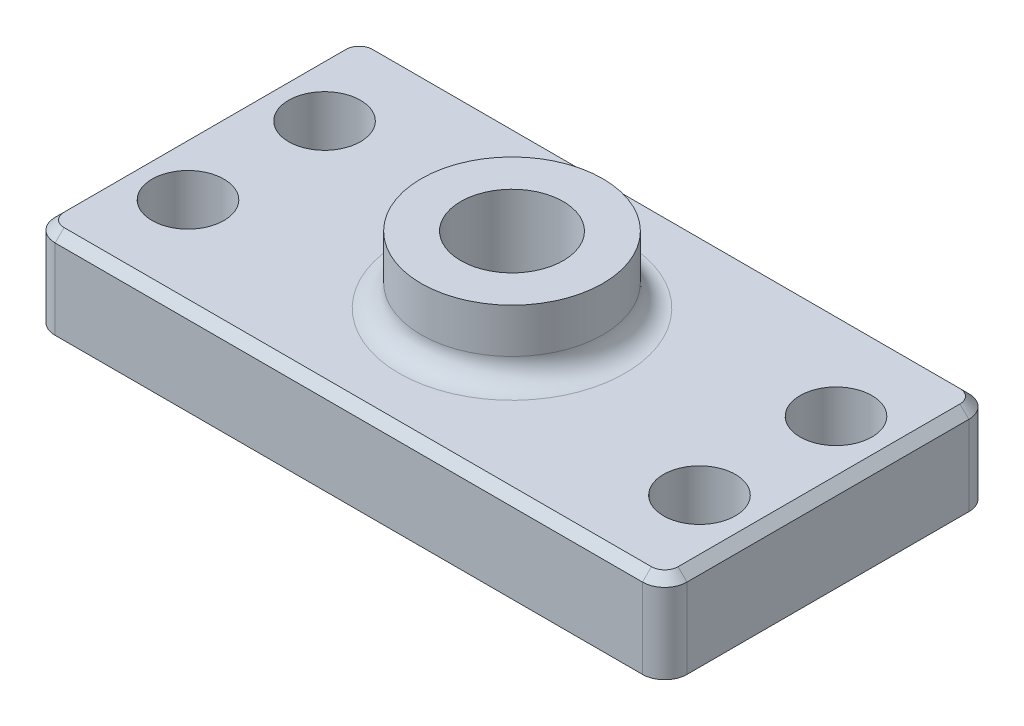
ISO-10303-21;
HEADER;
FILE_DESCRIPTION(('STEP AP214'),'2;1');
FILE_NAME('part.step','',(''),(''),'','','');
FILE_SCHEMA(('AUTOMOTIVE_DESIGN { 1 0 10303 214 1 1 1 1 }'));
ENDSEC;
DATA;
#1=APPLICATION_CONTEXT('core data for automotive mechanical design processes');
#2=APPLICATION_PROTOCOL_DEFINITION('international standard','automotive_design',2000,#1);
#3=PRODUCT_CONTEXT('',#1,'mechanical');
#4=PRODUCT('Part','Part','',(#3));
#5=PRODUCT_RELATED_PRODUCT_CATEGORY('part','',(#4));
#6=PRODUCT_DEFINITION_FORMATION('','',#4);
#7=PRODUCT_DEFINITION_CONTEXT('part definition',#1,'design');
#8=PRODUCT_DEFINITION('design','',#6,#7);
#9=PRODUCT_DEFINITION_SHAPE('','',#8);
#10=(LENGTH_UNIT() NAMED_UNIT(*) SI_UNIT(.MILLI.,.METRE.));
#11=(NAMED_UNIT(*) PLANE_ANGLE_UNIT() SI_UNIT($,.RADIAN.));
#12=(NAMED_UNIT(*) SI_UNIT($,.STERADIAN.) SOLID_ANGLE_UNIT());
#13=UNCERTAINTY_MEASURE_WITH_UNIT(LENGTH_MEASURE(1.E-05),#10,'distance_accuracy_value','');
#14=(GEOMETRIC_REPRESENTATION_CONTEXT(3) GLOBAL_UNCERTAINTY_ASSIGNED_CONTEXT((#13)) GLOBAL_UNIT_ASSIGNED_CONTEXT((#10,
#11,#12)) REPRESENTATION_CONTEXT('',''));
#15=CARTESIAN_POINT('',(0.,0.,0.));
#16=DIRECTION('',(0.,0.,1.));
#17=DIRECTION('',(1.,0.,0.));
#18=AXIS2_PLACEMENT_3D('',#15,#16,#17);
#19=CARTESIAN_POINT('',(0.,25.4,46.621775147929));
#20=DIRECTION('',(0.,0.,-1.));
#21=DIRECTION('',(-1.,0.,0.));
#22=AXIS2_PLACEMENT_3D('',#19,#20,#21);
#23=PLANE('',#22);
#24=DIRECTION('',(0.,-1.,0.));
#25=VECTOR('',#24,1.);
#26=CARTESIAN_POINT('',(83.9176923076923,25.4,46.621775147929));
#27=LINE('',#26,#25);
#28=CARTESIAN_POINT('',(83.9176923076923,0.,46.621775147929));
#29=VERTEX_POINT('',#28);
#30=CARTESIAN_POINT('',(83.9176923076923,22.86,46.621775147929));
#31=VERTEX_POINT('',#30);
#32=EDGE_CURVE('E181',#29,#31,#27,.F.);
#33=ORIENTED_EDGE('',*,*,#32,.T.);
#34=DIRECTION('',(-1.,0.,0.));
#35=VECTOR('',#34,1.);
#36=CARTESIAN_POINT('',(-83.9176923076923,22.86,46.621775147929));
#37=LINE('',#36,#35);
#38=CARTESIAN_POINT('',(-83.9176923076923,22.86,46.621775147929));
#39=VERTEX_POINT('',#38);
#40=EDGE_CURVE('E11',#31,#39,#37,.T.);
#41=ORIENTED_EDGE('',*,*,#40,.T.);
#42=DIRECTION('',(0.,-1.,0.));
#43=VECTOR('',#42,1.);
#44=CARTESIAN_POINT('',(-83.9176923076923,0.,46.621775147929));
#45=LINE('',#44,#43);
#46=CARTESIAN_POINT('',(-83.9176923076923,0.,46.621775147929));
#47=VERTEX_POINT('',#46);
#48=EDGE_CURVE('E179',#39,#47,#45,.T.);
#49=ORIENTED_EDGE('',*,*,#48,.T.);
#50=DIRECTION('',(1.,0.,0.));
#51=VECTOR('',#50,1.);
#52=CARTESIAN_POINT('',(0.,0.,46.621775147929));
#53=LINE('',#52,#51);
#54=EDGE_CURVE('E132',#47,#29,#53,.T.);
#55=ORIENTED_EDGE('',*,*,#54,.T.);
#56=EDGE_LOOP('',(#33,#41,#49,#55));
#57=FACE_BOUND('',#56,.T.);
#58=ADVANCED_FACE('F35',(#57),#23,.F.);
#59=CARTESIAN_POINT('',(90.2676923076923,25.4,0.));
#60=DIRECTION('',(-1.,0.,0.));
#61=DIRECTION('',(0.,0.,1.));
#62=AXIS2_PLACEMENT_3D('',#59,#60,#61);
#63=PLANE('',#62);
#64=DIRECTION('',(0.,-1.,0.));
#65=VECTOR('',#64,1.);
#66=CARTESIAN_POINT('',(90.2676923076923,25.4,-40.271775147929));
#67=LINE('',#66,#65);
#68=CARTESIAN_POINT('',(90.2676923076923,0.,-40.271775147929));
#69=VERTEX_POINT('',#68);
#70=CARTESIAN_POINT('',(90.2676923076923,22.86,-40.271775147929));
#71=VERTEX_POINT('',#70);
#72=EDGE_CURVE('E176',#69,#71,#67,.F.);
#73=ORIENTED_EDGE('',*,*,#72,.T.);
#74=DIRECTION('',(0.,0.,1.));
#75=VECTOR('',#74,1.);
#76=CARTESIAN_POINT('',(90.2676923076923,22.86,40.271775147929));
#77=LINE('',#76,#75);
#78=CARTESIAN_POINT('',(90.2676923076923,22.86,40.271775147929));
#79=VERTEX_POINT('',#78);
#80=EDGE_CURVE('E212',#71,#79,#77,.T.);
#81=ORIENTED_EDGE('',*,*,#80,.T.);
#82=DIRECTION('',(0.,-1.,0.));
#83=VECTOR('',#82,1.);
#84=CARTESIAN_POINT('',(90.2676923076923,25.4,40.271775147929));
#85=LINE('',#84,#83);
#86=CARTESIAN_POINT('',(90.2676923076923,0.,40.271775147929));
#87=VERTEX_POINT('',#86);
#88=EDGE_CURVE('E174',#79,#87,#85,.T.);
#89=ORIENTED_EDGE('',*,*,#88,.T.);
#90=DIRECTION('',(0.,0.,-1.));
#91=VECTOR('',#90,1.);
#92=CARTESIAN_POINT('',(90.2676923076923,0.,0.));
#93=LINE('',#92,#91);
#94=EDGE_CURVE('E267',#87,#69,#93,.T.);
#95=ORIENTED_EDGE('',*,*,#94,.T.);
#96=EDGE_LOOP('',(#73,#81,#89,#95));
#97=FACE_BOUND('',#96,.T.);
#98=ADVANCED_FACE('F295',(#97),#63,.F.);
#99=CARTESIAN_POINT('',(0.,25.4,-46.621775147929));
#100=DIRECTION('',(0.,0.,-1.));
#101=DIRECTION('',(-1.,0.,0.));
#102=AXIS2_PLACEMENT_3D('',#99,#100,#101);
#103=PLANE('',#102);
#104=DIRECTION('',(0.,-1.,0.));
#105=VECTOR('',#104,1.);
#106=CARTESIAN_POINT('',(-83.9176923076923,25.4,-46.621775147929));
#107=LINE('',#106,#105);
#108=CARTESIAN_POINT('',(-83.9176923076923,0.,-46.621775147929));
#109=VERTEX_POINT('',#108);
#110=CARTESIAN_POINT('',(-83.9176923076923,22.86,-46.621775147929));
#111=VERTEX_POINT('',#110);
#112=EDGE_CURVE('E168',#109,#111,#107,.F.);
#113=ORIENTED_EDGE('',*,*,#112,.T.);
#114=DIRECTION('',(1.,0.,0.));
#115=VECTOR('',#114,1.);
#116=CARTESIAN_POINT('',(0.,22.86,-46.621775147929));
#117=LINE('',#116,#115);
#118=CARTESIAN_POINT('',(83.9176923076923,22.86,-46.621775147929));
#119=VERTEX_POINT('',#118);
#120=EDGE_CURVE('E186',#111,#119,#117,.T.);
#121=ORIENTED_EDGE('',*,*,#120,.T.);
#122=DIRECTION('',(0.,-1.,0.));
#123=VECTOR('',#122,1.);
#124=CARTESIAN_POINT('',(83.9176923076923,0.,-46.621775147929));
#125=LINE('',#124,#123);
#126=CARTESIAN_POINT('',(83.9176923076923,0.,-46.621775147929));
#127=VERTEX_POINT('',#126);
#128=EDGE_CURVE('E166',#119,#127,#125,.T.);
#129=ORIENTED_EDGE('',*,*,#128,.T.);
#130=DIRECTION('',(1.,0.,0.));
#131=VECTOR('',#130,1.);
#132=CARTESIAN_POINT('',(0.,0.,-46.621775147929));
#133=LINE('',#132,#131);
#134=EDGE_CURVE('E146',#109,#127,#133,.T.);
#135=ORIENTED_EDGE('',*,*,#134,.F.);
#136=EDGE_LOOP('',(#113,#121,#129,#135));
#137=FACE_BOUND('',#136,.T.);
#138=ADVANCED_FACE('F300',(#137),#103,.T.);
#139=CARTESIAN_POINT('',(73.0738461538461,25.4,19.5084023668639));
#140=DIRECTION('',(0.,-1.,0.));
#141=DIRECTION('',(0.,0.,-1.));
#142=AXIS2_PLACEMENT_3D('',#139,#140,#141);
#143=CYLINDRICAL_SURFACE('',#142,10.2714876781594);
#144=CARTESIAN_POINT('',(73.0738461538461,25.4,19.5084023668639));
#145=DIRECTION('',(0.,1.,0.));
#146=DIRECTION('',(0.,0.,1.));
#147=AXIS2_PLACEMENT_3D('',#144,#145,#146);
#148=CIRCLE('',#147,10.2714876781594);
#149=CARTESIAN_POINT('',(73.0738461538461,25.4,29.7798900450233));
#150=VERTEX_POINT('',#149);
#151=EDGE_CURVE('E155',#150,#150,#148,.T.);
#152=ORIENTED_EDGE('',*,*,#151,.T.);
#153=EDGE_LOOP('',(#152));
#154=FACE_BOUND('',#153,.T.);
#155=CARTESIAN_POINT('',(73.0738461538461,0.,19.5084023668639));
#156=DIRECTION('',(0.,1.,0.));
#157=DIRECTION('',(0.,0.,1.));
#158=AXIS2_PLACEMENT_3D('',#155,#156,#157);
#159=CIRCLE('',#158,10.2714876781594);
#160=CARTESIAN_POINT('',(73.0738461538461,0.,29.7798900450233));
#161=VERTEX_POINT('',#160);
#162=EDGE_CURVE('E145',#161,#161,#159,.T.);
#163=ORIENTED_EDGE('',*,*,#162,.F.);
#164=EDGE_LOOP('',(#163));
#165=FACE_BOUND('',#164,.T.);
#166=ADVANCED_FACE('F387',(#154,#165),#143,.F.);
#167=CARTESIAN_POINT('',(-90.2676923076923,25.4,0.));
#168=DIRECTION('',(-1.,0.,0.));
#169=DIRECTION('',(0.,0.,1.));
#170=AXIS2_PLACEMENT_3D('',#167,#168,#169);
#171=PLANE('',#170);
#172=DIRECTION('',(0.,-1.,0.));
#173=VECTOR('',#172,1.);
#174=CARTESIAN_POINT('',(-90.2676923076923,25.4,40.271775147929));
#175=LINE('',#174,#173);
#176=CARTESIAN_POINT('',(-90.2676923076923,0.,40.271775147929));
#177=VERTEX_POINT('',#176);
#178=CARTESIAN_POINT('',(-90.2676923076923,22.86,40.271775147929));
#179=VERTEX_POINT('',#178);
#180=EDGE_CURVE('E141',#177,#179,#175,.F.);
#181=ORIENTED_EDGE('',*,*,#180,.T.);
#182=DIRECTION('',(0.,0.,-1.));
#183=VECTOR('',#182,1.);
#184=CARTESIAN_POINT('',(-90.2676923076923,22.86,0.));
#185=LINE('',#184,#183);
#186=CARTESIAN_POINT('',(-90.2676923076923,22.86,-40.271775147929));
#187=VERTEX_POINT('',#186);
#188=EDGE_CURVE('E210',#179,#187,#185,.T.);
#189=ORIENTED_EDGE('',*,*,#188,.T.);
#190=DIRECTION('',(0.,-1.,0.));
#191=VECTOR('',#190,1.);
#192=CARTESIAN_POINT('',(-90.2676923076923,25.4,-40.271775147929));
#193=LINE('',#192,#191);
#194=CARTESIAN_POINT('',(-90.2676923076923,0.,-40.271775147929));
#195=VERTEX_POINT('',#194);
#196=EDGE_CURVE('E136',#187,#195,#193,.T.);
#197=ORIENTED_EDGE('',*,*,#196,.T.);
#198=DIRECTION('',(0.,0.,-1.));
#199=VECTOR('',#198,1.);
#200=CARTESIAN_POINT('',(-90.2676923076923,0.,0.));
#201=LINE('',#200,#199);
#202=EDGE_CURVE('E130',#177,#195,#201,.T.);
#203=ORIENTED_EDGE('',*,*,#202,.F.);
#204=EDGE_LOOP('',(#181,#189,#197,#203));
#205=FACE_BOUND('',#204,.T.);
#206=ADVANCED_FACE('F140',(#205),#171,.T.);
#207=CARTESIAN_POINT('',(-73.0738461538461,25.4,-19.5084023668639));
#208=DIRECTION('',(0.,-1.,0.));
#209=DIRECTION('',(0.,0.,-1.));
#210=AXIS2_PLACEMENT_3D('',#207,#208,#209);
#211=CYLINDRICAL_SURFACE('',#210,10.2714876781594);
#212=CARTESIAN_POINT('',(-73.0738461538461,25.4,-19.5084023668639));
#213=DIRECTION('',(0.,1.,0.));
#214=DIRECTION('',(0.,0.,1.));
#215=AXIS2_PLACEMENT_3D('',#212,#213,#214);
#216=CIRCLE('',#215,10.2714876781594);
#217=CARTESIAN_POINT('',(-73.0738461538461,25.4,-9.23691468870453));
#218=VERTEX_POINT('',#217);
#219=EDGE_CURVE('E256',#218,#218,#216,.T.);
#220=ORIENTED_EDGE('',*,*,#219,.T.);
#221=EDGE_LOOP('',(#220));
#222=FACE_BOUND('',#221,.T.);
#223=CARTESIAN_POINT('',(-73.0738461538461,0.,-19.5084023668639));
#224=DIRECTION('',(0.,1.,0.));
#225=DIRECTION('',(0.,0.,1.));
#226=AXIS2_PLACEMENT_3D('',#223,#224,#225);
#227=CIRCLE('',#226,10.2714876781594);
#228=CARTESIAN_POINT('',(-73.0738461538461,0.,-9.23691468870453));
#229=VERTEX_POINT('',#228);
#230=EDGE_CURVE('E263',#229,#229,#227,.T.);
#231=ORIENTED_EDGE('',*,*,#230,.F.);
#232=EDGE_LOOP('',(#231));
#233=FACE_BOUND('',#232,.T.);
#234=ADVANCED_FACE('F305',(#222,#233),#211,.F.);
#235=CARTESIAN_POINT('',(73.0738461538461,25.4,-19.5084023668639));
#236=DIRECTION('',(0.,-1.,0.));
#237=DIRECTION('',(0.,0.,-1.));
#238=AXIS2_PLACEMENT_3D('',#235,#236,#237);
#239=CYLINDRICAL_SURFACE('',#238,10.2714876781594);
#240=CARTESIAN_POINT('',(73.0738461538461,25.4,-19.5084023668639));
#241=DIRECTION('',(0.,1.,0.));
#242=DIRECTION('',(0.,0.,1.));
#243=AXIS2_PLACEMENT_3D('',#240,#241,#242);
#244=CIRCLE('',#243,10.2714876781594);
#245=CARTESIAN_POINT('',(73.0738461538461,25.4,-9.23691468870453));
#246=VERTEX_POINT('',#245);
#247=EDGE_CURVE('E253',#246,#246,#244,.F.);
#248=ORIENTED_EDGE('',*,*,#247,.F.);
#249=EDGE_LOOP('',(#248));
#250=FACE_BOUND('',#249,.T.);
#251=CARTESIAN_POINT('',(73.0738461538461,0.,-19.5084023668639));
#252=DIRECTION('',(0.,1.,0.));
#253=DIRECTION('',(0.,0.,1.));
#254=AXIS2_PLACEMENT_3D('',#251,#252,#253);
#255=CIRCLE('',#254,10.2714876781594);
#256=CARTESIAN_POINT('',(73.0738461538461,0.,-9.23691468870453));
#257=VERTEX_POINT('',#256);
#258=EDGE_CURVE('E252',#257,#257,#255,.F.);
#259=ORIENTED_EDGE('',*,*,#258,.T.);
#260=EDGE_LOOP('',(#259));
#261=FACE_BOUND('',#260,.T.);
#262=ADVANCED_FACE('F308',(#250,#261),#239,.F.);
#263=CARTESIAN_POINT('',(-73.0738461538461,25.4,19.5084023668639));
#264=DIRECTION('',(0.,-1.,0.));
#265=DIRECTION('',(0.,0.,-1.));
#266=AXIS2_PLACEMENT_3D('',#263,#264,#265);
#267=CYLINDRICAL_SURFACE('',#266,10.2714876781594);
#268=CARTESIAN_POINT('',(-73.0738461538461,25.4,19.5084023668639));
#269=DIRECTION('',(0.,1.,0.));
#270=DIRECTION('',(0.,0.,1.));
#271=AXIS2_PLACEMENT_3D('',#268,#269,#270);
#272=CIRCLE('',#271,10.2714876781594);
#273=CARTESIAN_POINT('',(-73.0738461538461,25.4,29.7798900450233));
#274=VERTEX_POINT('',#273);
#275=EDGE_CURVE('E151',#274,#274,#272,.F.);
#276=ORIENTED_EDGE('',*,*,#275,.F.);
#277=EDGE_LOOP('',(#276));
#278=FACE_BOUND('',#277,.T.);
#279=CARTESIAN_POINT('',(-73.0738461538461,0.,19.5084023668639));
#280=DIRECTION('',(0.,1.,0.));
#281=DIRECTION('',(0.,0.,1.));
#282=AXIS2_PLACEMENT_3D('',#279,#280,#281);
#283=CIRCLE('',#282,10.2714876781594);
#284=CARTESIAN_POINT('',(-73.0738461538461,0.,29.7798900450233));
#285=VERTEX_POINT('',#284);
#286=EDGE_CURVE('E158',#285,#285,#283,.F.);
#287=ORIENTED_EDGE('',*,*,#286,.T.);
#288=EDGE_LOOP('',(#287));
#289=FACE_BOUND('',#288,.T.);
#290=ADVANCED_FACE('F276',(#278,#289),#267,.F.);
#291=CARTESIAN_POINT('',(0.,25.4,0.));
#292=DIRECTION('',(0.,1.,0.));
#293=DIRECTION('',(0.,0.,1.));
#294=AXIS2_PLACEMENT_3D('',#291,#292,#293);
#295=PLANE('',#294);
#296=CARTESIAN_POINT('',(83.9176923076923,25.4,-40.271775147929));
#297=DIRECTION('',(0.,1.,0.));
#298=DIRECTION('',(0.,0.,1.));
#299=AXIS2_PLACEMENT_3D('',#296,#297,#298);
#300=CIRCLE('',#299,3.80999999999998);
#301=CARTESIAN_POINT('',(87.7276923076923,25.4,-40.271775147929));
#302=VERTEX_POINT('',#301);
#303=CARTESIAN_POINT('',(83.9176923076923,25.4,-44.081775147929));
#304=VERTEX_POINT('',#303);
#305=EDGE_CURVE('E199',#302,#304,#300,.T.);
#306=ORIENTED_EDGE('',*,*,#305,.T.);
#307=DIRECTION('',(-1.,0.,0.));
#308=VECTOR('',#307,1.);
#309=CARTESIAN_POINT('',(0.,25.4,-44.081775147929));
#310=LINE('',#309,#308);
#311=CARTESIAN_POINT('',(-83.9176923076923,25.4,-44.081775147929));
#312=VERTEX_POINT('',#311);
#313=EDGE_CURVE('E203',#304,#312,#310,.T.);
#314=ORIENTED_EDGE('',*,*,#313,.T.);
#315=CARTESIAN_POINT('',(-83.9176923076923,25.4,-40.271775147929));
#316=DIRECTION('',(0.,1.,0.));
#317=DIRECTION('',(0.,0.,1.));
#318=AXIS2_PLACEMENT_3D('',#315,#316,#317);
#319=CIRCLE('',#318,3.80999999999998);
#320=CARTESIAN_POINT('',(-87.7276923076923,25.4,-40.271775147929));
#321=VERTEX_POINT('',#320);
#322=EDGE_CURVE('E201',#312,#321,#319,.T.);
#323=ORIENTED_EDGE('',*,*,#322,.T.);
#324=DIRECTION('',(0.,0.,1.));
#325=VECTOR('',#324,1.);
#326=CARTESIAN_POINT('',(-87.7276923076923,25.4,0.));
#327=LINE('',#326,#325);
#328=CARTESIAN_POINT('',(-87.7276923076923,25.4,40.271775147929));
#329=VERTEX_POINT('',#328);
#330=EDGE_CURVE('E197',#321,#329,#327,.T.);
#331=ORIENTED_EDGE('',*,*,#330,.T.);
#332=CARTESIAN_POINT('',(-83.9176923076923,25.4,40.271775147929));
#333=DIRECTION('',(0.,1.,0.));
#334=DIRECTION('',(0.,0.,1.));
#335=AXIS2_PLACEMENT_3D('',#332,#333,#334);
#336=CIRCLE('',#335,3.80999999999998);
#337=CARTESIAN_POINT('',(-83.9176923076923,25.4,44.081775147929));
#338=VERTEX_POINT('',#337);
#339=EDGE_CURVE('E193',#329,#338,#336,.T.);
#340=ORIENTED_EDGE('',*,*,#339,.T.);
#341=DIRECTION('',(1.,0.,0.));
#342=VECTOR('',#341,1.);
#343=CARTESIAN_POINT('',(83.9176923076923,25.4,44.081775147929));
#344=LINE('',#343,#342);
#345=CARTESIAN_POINT('',(83.9176923076923,25.4,44.081775147929));
#346=VERTEX_POINT('',#345);
#347=EDGE_CURVE('E189',#338,#346,#344,.T.);
#348=ORIENTED_EDGE('',*,*,#347,.T.);
#349=CARTESIAN_POINT('',(83.9176923076923,25.4,40.271775147929));
#350=DIRECTION('',(0.,1.,0.));
#351=DIRECTION('',(0.,0.,1.));
#352=AXIS2_PLACEMENT_3D('',#349,#350,#351);
#353=CIRCLE('',#352,3.80999999999998);
#354=CARTESIAN_POINT('',(87.7276923076923,25.4,40.271775147929));
#355=VERTEX_POINT('',#354);
#356=EDGE_CURVE('E191',#346,#355,#353,.T.);
#357=ORIENTED_EDGE('',*,*,#356,.T.);
#358=DIRECTION('',(0.,0.,-1.));
#359=VECTOR('',#358,1.);
#360=CARTESIAN_POINT('',(87.7276923076923,25.4,-40.271775147929));
#361=LINE('',#360,#359);
#362=EDGE_CURVE('E195',#355,#302,#361,.T.);
#363=ORIENTED_EDGE('',*,*,#362,.T.);
#364=EDGE_LOOP('',(#306,#314,#323,#331,#340,#348,#357,#363));
#365=FACE_BOUND('',#364,.T.);
#366=CARTESIAN_POINT('',(0.,25.4,0.));
#367=DIRECTION('',(0.,1.,0.));
#368=DIRECTION('',(0.,0.,1.));
#369=AXIS2_PLACEMENT_3D('',#366,#367,#368);
#370=CIRCLE('',#369,32.2948153627203);
#371=CARTESIAN_POINT('',(0.,25.4,32.2948153627203));
#372=VERTEX_POINT('',#371);
#373=EDGE_CURVE('E171',#372,#372,#370,.F.);
#374=ORIENTED_EDGE('',*,*,#373,.T.);
#375=EDGE_LOOP('',(#374));
#376=FACE_BOUND('',#375,.T.);
#377=ORIENTED_EDGE('',*,*,#247,.T.);
#378=EDGE_LOOP('',(#377));
#379=FACE_BOUND('',#378,.T.);
#380=ORIENTED_EDGE('',*,*,#219,.F.);
#381=EDGE_LOOP('',(#380));
#382=FACE_BOUND('',#381,.T.);
#383=ORIENTED_EDGE('',*,*,#151,.F.);
#384=EDGE_LOOP('',(#383));
#385=FACE_BOUND('',#384,.T.);
#386=ORIENTED_EDGE('',*,*,#275,.T.);
#387=EDGE_LOOP('',(#386));
#388=FACE_BOUND('',#387,.T.);
#389=ADVANCED_FACE('F280',(#365,#376,#379,#382,#385,#388),#295,.T.);
#390=CARTESIAN_POINT('',(0.,0.,0.));
#391=DIRECTION('',(0.,1.,0.));
#392=DIRECTION('',(0.,0.,1.));
#393=AXIS2_PLACEMENT_3D('',#390,#391,#392);
#394=PLANE('',#393);
#395=CARTESIAN_POINT('',(0.,0.,0.));
#396=DIRECTION('',(0.,1.,0.));
#397=DIRECTION('',(0.,0.,1.));
#398=AXIS2_PLACEMENT_3D('',#395,#396,#397);
#399=CIRCLE('',#398,14.6480029344672);
#400=CARTESIAN_POINT('',(0.,0.,14.6480029344672));
#401=VERTEX_POINT('',#400);
#402=EDGE_CURVE('E242',#401,#401,#399,.T.);
#403=ORIENTED_EDGE('',*,*,#402,.T.);
#404=EDGE_LOOP('',(#403));
#405=FACE_BOUND('',#404,.T.);
#406=ORIENTED_EDGE('',*,*,#258,.F.);
#407=EDGE_LOOP('',(#406));
#408=FACE_BOUND('',#407,.T.);
#409=ORIENTED_EDGE('',*,*,#230,.T.);
#410=EDGE_LOOP('',(#409));
#411=FACE_BOUND('',#410,.T.);
#412=ORIENTED_EDGE('',*,*,#202,.T.);
#413=CARTESIAN_POINT('',(-83.9176923076923,0.,-40.271775147929));
#414=DIRECTION('',(0.,1.,0.));
#415=DIRECTION('',(0.,0.,1.));
#416=AXIS2_PLACEMENT_3D('',#413,#414,#415);
#417=CIRCLE('',#416,6.35);
#418=EDGE_CURVE('E164',#195,#109,#417,.F.);
#419=ORIENTED_EDGE('',*,*,#418,.T.);
#420=ORIENTED_EDGE('',*,*,#134,.T.);
#421=CARTESIAN_POINT('',(83.9176923076923,0.,-40.271775147929));
#422=DIRECTION('',(0.,1.,0.));
#423=DIRECTION('',(0.,0.,1.));
#424=AXIS2_PLACEMENT_3D('',#421,#422,#423);
#425=CIRCLE('',#424,6.35);
#426=EDGE_CURVE('E162',#127,#69,#425,.F.);
#427=ORIENTED_EDGE('',*,*,#426,.T.);
#428=ORIENTED_EDGE('',*,*,#94,.F.);
#429=CARTESIAN_POINT('',(83.9176923076923,0.,40.271775147929));
#430=DIRECTION('',(0.,1.,0.));
#431=DIRECTION('',(0.,0.,1.));
#432=AXIS2_PLACEMENT_3D('',#429,#430,#431);
#433=CIRCLE('',#432,6.35);
#434=EDGE_CURVE('E135',#87,#29,#433,.F.);
#435=ORIENTED_EDGE('',*,*,#434,.T.);
#436=ORIENTED_EDGE('',*,*,#54,.F.);
#437=CARTESIAN_POINT('',(-83.9176923076923,0.,40.271775147929));
#438=DIRECTION('',(0.,1.,0.));
#439=DIRECTION('',(0.,0.,1.));
#440=AXIS2_PLACEMENT_3D('',#437,#438,#439);
#441=CIRCLE('',#440,6.35);
#442=EDGE_CURVE('E126',#47,#177,#441,.F.);
#443=ORIENTED_EDGE('',*,*,#442,.T.);
#444=EDGE_LOOP('',(#412,#419,#420,#427,#428,#435,#436,#443));
#445=FACE_BOUND('',#444,.T.);
#446=ORIENTED_EDGE('',*,*,#162,.T.);
#447=EDGE_LOOP('',(#446));
#448=FACE_BOUND('',#447,.T.);
#449=ORIENTED_EDGE('',*,*,#286,.F.);
#450=EDGE_LOOP('',(#449));
#451=FACE_BOUND('',#450,.T.);
#452=ADVANCED_FACE('F128',(#405,#408,#411,#445,#448,#451),#394,.F.);
#453=CARTESIAN_POINT('',(0.,44.45,0.));
#454=DIRECTION('',(0.,-1.,0.));
#455=DIRECTION('',(0.,0.,-1.));
#456=AXIS2_PLACEMENT_3D('',#453,#454,#455);
#457=CYLINDRICAL_SURFACE('',#456,25.9448153627203);
#458=CARTESIAN_POINT('',(0.,31.75,0.));
#459=DIRECTION('',(0.,1.,0.));
#460=DIRECTION('',(0.,0.,1.));
#461=AXIS2_PLACEMENT_3D('',#458,#459,#460);
#462=CIRCLE('',#461,25.9448153627203);
#463=CARTESIAN_POINT('',(0.,31.75,-25.9448153627203));
#464=VERTEX_POINT('',#463);
#465=EDGE_CURVE('E183',#464,#464,#462,.T.);
#466=CARTESIAN_POINT('',(0.,44.45,0.));
#467=DIRECTION('',(0.,1.,0.));
#468=DIRECTION('',(0.,0.,1.));
#469=AXIS2_PLACEMENT_3D('',#466,#467,#468);
#470=CIRCLE('',#469,25.9448153627203);
#471=CARTESIAN_POINT('',(0.,44.45,-25.9448153627203));
#472=VERTEX_POINT('',#471);
#473=EDGE_CURVE('E247',#472,#472,#470,.T.);
#474=CARTESIAN_POINT('',(0.,31.75,-25.9448153627203));
#475=CARTESIAN_POINT('',(0.,31.8822916666667,-25.9448153627203));
#476=CARTESIAN_POINT('',(0.,32.0145833333333,-25.9448153627203));
#477=CARTESIAN_POINT('',(0.,32.2791666666667,-25.9448153627203));
#478=CARTESIAN_POINT('',(0.,32.4114583333333,-25.9448153627203));
#479=CARTESIAN_POINT('',(0.,32.6760416666667,-25.9448153627203));
#480=CARTESIAN_POINT('',(0.,32.8083333333333,-25.9448153627203));
#481=CARTESIAN_POINT('',(0.,33.0729166666667,-25.9448153627203));
#482=CARTESIAN_POINT('',(0.,33.2052083333333,-25.9448153627203));
#483=CARTESIAN_POINT('',(0.,33.4697916666667,-25.9448153627203));
#484=CARTESIAN_POINT('',(0.,33.6020833333333,-25.9448153627203));
#485=CARTESIAN_POINT('',(0.,33.8666666666667,-25.9448153627203));
#486=CARTESIAN_POINT('',(0.,33.9989583333333,-25.9448153627203));
#487=CARTESIAN_POINT('',(0.,34.2635416666667,-25.9448153627203));
#488=CARTESIAN_POINT('',(0.,34.3958333333333,-25.9448153627203));
#489=CARTESIAN_POINT('',(0.,34.6604166666667,-25.9448153627203));
#490=CARTESIAN_POINT('',(0.,34.7927083333333,-25.9448153627203));
#491=CARTESIAN_POINT('',(0.,35.0572916666667,-25.9448153627203));
#492=CARTESIAN_POINT('',(0.,35.1895833333333,-25.9448153627203));
#493=CARTESIAN_POINT('',(0.,35.4541666666667,-25.9448153627203));
#494=CARTESIAN_POINT('',(0.,35.5864583333333,-25.9448153627203));
#495=CARTESIAN_POINT('',(0.,35.8510416666667,-25.9448153627203));
#496=CARTESIAN_POINT('',(0.,35.9833333333333,-25.9448153627203));
#497=CARTESIAN_POINT('',(0.,36.2479166666667,-25.9448153627203));
#498=CARTESIAN_POINT('',(0.,36.3802083333333,-25.9448153627203));
#499=CARTESIAN_POINT('',(0.,36.6447916666667,-25.9448153627203));
#500=CARTESIAN_POINT('',(0.,36.7770833333333,-25.9448153627203));
#501=CARTESIAN_POINT('',(0.,37.0416666666667,-25.9448153627203));
#502=CARTESIAN_POINT('',(0.,37.1739583333333,-25.9448153627203));
#503=CARTESIAN_POINT('',(0.,37.4385416666667,-25.9448153627203));
#504=CARTESIAN_POINT('',(0.,37.5708333333333,-25.9448153627203));
#505=CARTESIAN_POINT('',(0.,37.8354166666667,-25.9448153627203));
#506=CARTESIAN_POINT('',(0.,37.9677083333333,-25.9448153627203));
#507=CARTESIAN_POINT('',(0.,38.2322916666667,-25.9448153627203));
#508=CARTESIAN_POINT('',(0.,38.3645833333333,-25.9448153627203));
#509=CARTESIAN_POINT('',(0.,38.6291666666667,-25.9448153627203));
#510=CARTESIAN_POINT('',(0.,38.7614583333333,-25.9448153627203));
#511=CARTESIAN_POINT('',(0.,39.0260416666667,-25.9448153627203));
#512=CARTESIAN_POINT('',(0.,39.1583333333333,-25.9448153627203));
#513=CARTESIAN_POINT('',(0.,39.4229166666667,-25.9448153627203));
#514=CARTESIAN_POINT('',(0.,39.5552083333333,-25.9448153627203));
#515=CARTESIAN_POINT('',(0.,39.8197916666667,-25.9448153627203));
#516=CARTESIAN_POINT('',(0.,39.9520833333333,-25.9448153627203));
#517=CARTESIAN_POINT('',(0.,40.2166666666667,-25.9448153627203));
#518=CARTESIAN_POINT('',(0.,40.3489583333333,-25.9448153627203));
#519=CARTESIAN_POINT('',(0.,40.6135416666667,-25.9448153627203));
#520=CARTESIAN_POINT('',(0.,40.7458333333333,-25.9448153627203));
#521=CARTESIAN_POINT('',(0.,41.0104166666667,-25.9448153627203));
#522=CARTESIAN_POINT('',(0.,41.1427083333333,-25.9448153627203));
#523=CARTESIAN_POINT('',(0.,41.4072916666667,-25.9448153627203));
#524=CARTESIAN_POINT('',(0.,41.5395833333333,-25.9448153627203));
#525=CARTESIAN_POINT('',(0.,41.8041666666667,-25.9448153627203));
#526=CARTESIAN_POINT('',(0.,41.9364583333333,-25.9448153627203));
#527=CARTESIAN_POINT('',(0.,42.2010416666667,-25.9448153627203));
#528=CARTESIAN_POINT('',(0.,42.3333333333333,-25.9448153627203));
#529=CARTESIAN_POINT('',(0.,42.5979166666667,-25.9448153627203));
#530=CARTESIAN_POINT('',(0.,42.7302083333333,-25.9448153627203));
#531=CARTESIAN_POINT('',(0.,42.9947916666667,-25.9448153627203));
#532=CARTESIAN_POINT('',(0.,43.1270833333333,-25.9448153627203));
#533=CARTESIAN_POINT('',(0.,43.3916666666667,-25.9448153627203));
#534=CARTESIAN_POINT('',(0.,43.5239583333333,-25.9448153627203));
#535=CARTESIAN_POINT('',(0.,43.7885416666667,-25.9448153627203));
#536=CARTESIAN_POINT('',(0.,43.9208333333333,-25.9448153627203));
#537=CARTESIAN_POINT('',(0.,44.1854166666667,-25.9448153627203));
#538=CARTESIAN_POINT('',(0.,44.3177083333333,-25.9448153627203));
#539=CARTESIAN_POINT('',(0.,44.45,-25.9448153627203));
#540=B_SPLINE_CURVE_WITH_KNOTS('',3,(#474,#475,#476,#477,#478,#479,#480,#481,#482,#483,#484,
#485,#486,#487,#488,#489,#490,#491,#492,#493,#494,#495,#496,#497,#498,#499,#500,#501,#502,#503,
#504,#505,#506,#507,#508,#509,#510,#511,#512,#513,#514,#515,#516,#517,#518,#519,#520,#521,#522,
#523,#524,#525,#526,#527,#528,#529,#530,#531,#532,#533,#534,#535,#536,#537,#538,#539),
.UNSPECIFIED.,.F.,.F.,(4,2,2,2,2,2,2,2,2,2,2,2,2,2,2,2,2,2,2,2,2,2,2,2,2,2,2,2,2,2,2,2,4),(0.,
0.396874999999998,0.793750000000003,1.190625,1.5875,1.984375,2.38125,2.778125,3.175,3.571875,
3.96875,4.365625,4.7625,5.159375,5.55625000000001,5.953125,6.35,6.74687500000001,7.14375,
7.540625,7.93750000000001,8.334375,8.73125,9.12812500000001,9.52500000000001,9.921875,10.31875,
10.715625,11.1125,11.509375,11.90625,12.303125,12.7),.UNSPECIFIED.);
#541=EDGE_CURVE('BSEAM279',#464,#472,#540,.T.);
#542=ORIENTED_EDGE('',*,*,#465,.T.);
#543=ORIENTED_EDGE('',*,*,#473,.F.);
#544=ORIENTED_EDGE('',*,*,#541,.T.);
#545=ORIENTED_EDGE('',*,*,#541,.F.);
#546=EDGE_LOOP('',(#542,#544,#543,#545));
#547=FACE_BOUND('',#546,.T.);
#548=ADVANCED_FACE('F279',(#547),#457,.T.);
#549=CARTESIAN_POINT('',(0.,44.45,0.));
#550=DIRECTION('',(0.,1.,0.));
#551=DIRECTION('',(0.,0.,1.));
#552=AXIS2_PLACEMENT_3D('',#549,#550,#551);
#553=PLANE('',#552);
#554=CARTESIAN_POINT('',(0.,44.45,0.));
#555=DIRECTION('',(0.,1.,0.));
#556=DIRECTION('',(0.,0.,1.));
#557=AXIS2_PLACEMENT_3D('',#554,#555,#556);
#558=CIRCLE('',#557,14.6480029344672);
#559=CARTESIAN_POINT('',(0.,44.45,14.6480029344672));
#560=VERTEX_POINT('',#559);
#561=EDGE_CURVE('E237',#560,#560,#558,.T.);
#562=ORIENTED_EDGE('',*,*,#561,.F.);
#563=EDGE_LOOP('',(#562));
#564=FACE_BOUND('',#563,.T.);
#565=ORIENTED_EDGE('',*,*,#473,.T.);
#566=EDGE_LOOP('',(#565));
#567=FACE_BOUND('',#566,.T.);
#568=ADVANCED_FACE('F287',(#564,#567),#553,.T.);
#569=CARTESIAN_POINT('',(0.,0.,0.));
#570=DIRECTION('',(0.,1.,0.));
#571=DIRECTION('',(0.,0.,1.));
#572=AXIS2_PLACEMENT_3D('',#569,#570,#571);
#573=CYLINDRICAL_SURFACE('',#572,14.6480029344672);
#574=ORIENTED_EDGE('',*,*,#402,.F.);
#575=EDGE_LOOP('',(#574));
#576=FACE_BOUND('',#575,.T.);
#577=ORIENTED_EDGE('',*,*,#561,.T.);
#578=EDGE_LOOP('',(#577));
#579=FACE_BOUND('',#578,.T.);
#580=ADVANCED_FACE('F317',(#576,#579),#573,.F.);
#581=CARTESIAN_POINT('',(-83.9176923076923,25.4,-40.271775147929));
#582=DIRECTION('',(0.,-1.,0.));
#583=DIRECTION('',(0.,0.,-1.));
#584=AXIS2_PLACEMENT_3D('',#581,#582,#583);
#585=CYLINDRICAL_SURFACE('',#584,6.35);
#586=ORIENTED_EDGE('',*,*,#196,.F.);
#587=CARTESIAN_POINT('',(-83.9176923076923,22.86,-40.271775147929));
#588=DIRECTION('',(0.,1.,0.));
#589=DIRECTION('',(0.,0.,1.));
#590=AXIS2_PLACEMENT_3D('',#587,#588,#589);
#591=CIRCLE('',#590,6.35);
#592=EDGE_CURVE('E206',#187,#111,#591,.F.);
#593=ORIENTED_EDGE('',*,*,#592,.T.);
#594=ORIENTED_EDGE('',*,*,#112,.F.);
#595=ORIENTED_EDGE('',*,*,#418,.F.);
#596=EDGE_LOOP('',(#586,#593,#594,#595));
#597=FACE_BOUND('',#596,.T.);
#598=ADVANCED_FACE('F313',(#597),#585,.T.);
#599=CARTESIAN_POINT('',(83.9176923076923,25.4,-40.271775147929));
#600=DIRECTION('',(0.,1.,0.));
#601=DIRECTION('',(0.,0.,1.));
#602=AXIS2_PLACEMENT_3D('',#599,#600,#601);
#603=CYLINDRICAL_SURFACE('',#602,6.35);
#604=ORIENTED_EDGE('',*,*,#128,.F.);
#605=CARTESIAN_POINT('',(83.9176923076923,22.86,-40.271775147929));
#606=DIRECTION('',(0.,1.,0.));
#607=DIRECTION('',(0.,0.,1.));
#608=AXIS2_PLACEMENT_3D('',#605,#606,#607);
#609=CIRCLE('',#608,6.35);
#610=EDGE_CURVE('E208',#119,#71,#609,.F.);
#611=ORIENTED_EDGE('',*,*,#610,.T.);
#612=ORIENTED_EDGE('',*,*,#72,.F.);
#613=ORIENTED_EDGE('',*,*,#426,.F.);
#614=EDGE_LOOP('',(#604,#611,#612,#613));
#615=FACE_BOUND('',#614,.T.);
#616=ADVANCED_FACE('F316',(#615),#603,.T.);
#617=CARTESIAN_POINT('',(83.9176923076923,25.4,40.271775147929));
#618=DIRECTION('',(0.,-1.,0.));
#619=DIRECTION('',(0.,0.,-1.));
#620=AXIS2_PLACEMENT_3D('',#617,#618,#619);
#621=CYLINDRICAL_SURFACE('',#620,6.35);
#622=ORIENTED_EDGE('',*,*,#88,.F.);
#623=CARTESIAN_POINT('',(83.9176923076923,22.86,40.271775147929));
#624=DIRECTION('',(0.,1.,0.));
#625=DIRECTION('',(0.,0.,1.));
#626=AXIS2_PLACEMENT_3D('',#623,#624,#625);
#627=CIRCLE('',#626,6.35);
#628=EDGE_CURVE('E44',#79,#31,#627,.F.);
#629=ORIENTED_EDGE('',*,*,#628,.T.);
#630=ORIENTED_EDGE('',*,*,#32,.F.);
#631=ORIENTED_EDGE('',*,*,#434,.F.);
#632=EDGE_LOOP('',(#622,#629,#630,#631));
#633=FACE_BOUND('',#632,.T.);
#634=ADVANCED_FACE('F321',(#633),#621,.T.);
#635=CARTESIAN_POINT('',(0.,31.75,0.));
#636=DIRECTION('',(0.,1.,0.));
#637=DIRECTION('',(0.,0.,1.));
#638=AXIS2_PLACEMENT_3D('',#635,#636,#637);
#639=TOROIDAL_SURFACE('',#638,32.2948153627203,6.35);
#640=ORIENTED_EDGE('',*,*,#373,.F.);
#641=EDGE_LOOP('',(#640));
#642=FACE_BOUND('',#641,.T.);
#643=ORIENTED_EDGE('',*,*,#465,.F.);
#644=EDGE_LOOP('',(#643));
#645=FACE_BOUND('',#644,.T.);
#646=ADVANCED_FACE('F325',(#642,#645),#639,.F.);
#647=CARTESIAN_POINT('',(-83.9176923076923,25.4,40.271775147929));
#648=DIRECTION('',(0.,1.,0.));
#649=DIRECTION('',(0.,0.,1.));
#650=AXIS2_PLACEMENT_3D('',#647,#648,#649);
#651=CYLINDRICAL_SURFACE('',#650,6.35);
#652=ORIENTED_EDGE('',*,*,#48,.F.);
#653=CARTESIAN_POINT('',(-83.9176923076923,22.86,40.271775147929));
#654=DIRECTION('',(0.,1.,0.));
#655=DIRECTION('',(0.,0.,1.));
#656=AXIS2_PLACEMENT_3D('',#653,#654,#655);
#657=CIRCLE('',#656,6.35);
#658=EDGE_CURVE('E150',#39,#179,#657,.F.);
#659=ORIENTED_EDGE('',*,*,#658,.T.);
#660=ORIENTED_EDGE('',*,*,#180,.F.);
#661=ORIENTED_EDGE('',*,*,#442,.F.);
#662=EDGE_LOOP('',(#652,#659,#660,#661));
#663=FACE_BOUND('',#662,.T.);
#664=ADVANCED_FACE('F148',(#663),#651,.T.);
#665=CARTESIAN_POINT('',(0.,25.4,44.081775147929));
#666=DIRECTION('',(0.,0.707106781186547,0.707106781186547));
#667=DIRECTION('',(-1.,0.,0.));
#668=AXIS2_PLACEMENT_3D('',#665,#666,#667);
#669=PLANE('',#668);
#670=DIRECTION('',(0.,-0.707106781186547,0.707106781186547));
#671=VECTOR('',#670,1.);
#672=CARTESIAN_POINT('',(83.9176923076923,25.4,44.081775147929));
#673=LINE('',#672,#671);
#674=EDGE_CURVE('E231',#346,#31,#673,.T.);
#675=ORIENTED_EDGE('',*,*,#674,.F.);
#676=ORIENTED_EDGE('',*,*,#347,.F.);
#677=DIRECTION('',(0.,0.707106781186547,-0.707106781186547));
#678=VECTOR('',#677,1.);
#679=CARTESIAN_POINT('',(-83.9176923076923,22.86,46.621775147929));
#680=LINE('',#679,#678);
#681=EDGE_CURVE('E39',#39,#338,#680,.T.);
#682=ORIENTED_EDGE('',*,*,#681,.F.);
#683=ORIENTED_EDGE('',*,*,#40,.F.);
#684=EDGE_LOOP('',(#675,#676,#682,#683));
#685=FACE_BOUND('',#684,.T.);
#686=ADVANCED_FACE('F37',(#685),#669,.T.);
#687=CARTESIAN_POINT('',(-83.9176923076923,25.4,40.271775147929));
#688=DIRECTION('',(0.,-1.,0.));
#689=DIRECTION('',(0.,0.,-1.));
#690=AXIS2_PLACEMENT_3D('',#687,#688,#689);
#691=CONICAL_SURFACE('',#690,3.80999999999998,0.785398163397449);
#692=ORIENTED_EDGE('',*,*,#681,.T.);
#693=ORIENTED_EDGE('',*,*,#339,.F.);
#694=DIRECTION('',(0.707106781186547,0.707106781186547,0.));
#695=VECTOR('',#694,1.);
#696=CARTESIAN_POINT('',(-90.2676923076923,22.86,40.271775147929));
#697=LINE('',#696,#695);
#698=EDGE_CURVE('E229',#179,#329,#697,.T.);
#699=ORIENTED_EDGE('',*,*,#698,.F.);
#700=ORIENTED_EDGE('',*,*,#658,.F.);
#701=EDGE_LOOP('',(#692,#693,#699,#700));
#702=FACE_BOUND('',#701,.T.);
#703=ADVANCED_FACE('F353',(#702),#691,.T.);
#704=CARTESIAN_POINT('',(83.9176923076923,25.4,40.271775147929));
#705=DIRECTION('',(0.,-1.,0.));
#706=DIRECTION('',(0.,0.,-1.));
#707=AXIS2_PLACEMENT_3D('',#704,#705,#706);
#708=CONICAL_SURFACE('',#707,3.80999999999999,0.785398163397448);
#709=ORIENTED_EDGE('',*,*,#674,.T.);
#710=ORIENTED_EDGE('',*,*,#628,.F.);
#711=DIRECTION('',(0.707106781186547,-0.707106781186547,0.));
#712=VECTOR('',#711,1.);
#713=CARTESIAN_POINT('',(87.7276923076923,25.4,40.271775147929));
#714=LINE('',#713,#712);
#715=EDGE_CURVE('E226',#355,#79,#714,.T.);
#716=ORIENTED_EDGE('',*,*,#715,.F.);
#717=ORIENTED_EDGE('',*,*,#356,.F.);
#718=EDGE_LOOP('',(#709,#710,#716,#717));
#719=FACE_BOUND('',#718,.T.);
#720=ADVANCED_FACE('F350',(#719),#708,.T.);
#721=CARTESIAN_POINT('',(-90.2676923076923,22.86,0.));
#722=DIRECTION('',(0.707106781186547,-0.707106781186547,0.));
#723=DIRECTION('',(0.,0.,-1.));
#724=AXIS2_PLACEMENT_3D('',#721,#722,#723);
#725=PLANE('',#724);
#726=ORIENTED_EDGE('',*,*,#698,.T.);
#727=ORIENTED_EDGE('',*,*,#330,.F.);
#728=DIRECTION('',(0.707106781186547,0.707106781186547,0.));
#729=VECTOR('',#728,1.);
#730=CARTESIAN_POINT('',(-90.2676923076923,22.86,-40.271775147929));
#731=LINE('',#730,#729);
#732=EDGE_CURVE('E223',#187,#321,#731,.T.);
#733=ORIENTED_EDGE('',*,*,#732,.F.);
#734=ORIENTED_EDGE('',*,*,#188,.F.);
#735=EDGE_LOOP('',(#726,#727,#733,#734));
#736=FACE_BOUND('',#735,.T.);
#737=ADVANCED_FACE('F346',(#736),#725,.F.);
#738=CARTESIAN_POINT('',(87.7276923076923,25.4,0.));
#739=DIRECTION('',(0.707106781186547,0.707106781186547,0.));
#740=DIRECTION('',(0.,0.,1.));
#741=AXIS2_PLACEMENT_3D('',#738,#739,#740);
#742=PLANE('',#741);
#743=ORIENTED_EDGE('',*,*,#715,.T.);
#744=ORIENTED_EDGE('',*,*,#80,.F.);
#745=DIRECTION('',(0.707106781186547,-0.707106781186547,0.));
#746=VECTOR('',#745,1.);
#747=CARTESIAN_POINT('',(87.7276923076923,25.4,-40.271775147929));
#748=LINE('',#747,#746);
#749=EDGE_CURVE('E220',#302,#71,#748,.T.);
#750=ORIENTED_EDGE('',*,*,#749,.F.);
#751=ORIENTED_EDGE('',*,*,#362,.F.);
#752=EDGE_LOOP('',(#743,#744,#750,#751));
#753=FACE_BOUND('',#752,.T.);
#754=ADVANCED_FACE('F342',(#753),#742,.T.);
#755=CARTESIAN_POINT('',(-83.9176923076923,25.4,-40.271775147929));
#756=DIRECTION('',(0.,-1.,0.));
#757=DIRECTION('',(0.,0.,-1.));
#758=AXIS2_PLACEMENT_3D('',#755,#756,#757);
#759=CONICAL_SURFACE('',#758,3.80999999999999,0.785398163397448);
#760=ORIENTED_EDGE('',*,*,#732,.T.);
#761=ORIENTED_EDGE('',*,*,#322,.F.);
#762=DIRECTION('',(0.,0.707106781186547,0.707106781186549));
#763=VECTOR('',#762,1.);
#764=CARTESIAN_POINT('',(-83.9176923076923,22.86,-46.621775147929));
#765=LINE('',#764,#763);
#766=EDGE_CURVE('E218',#111,#312,#765,.T.);
#767=ORIENTED_EDGE('',*,*,#766,.F.);
#768=ORIENTED_EDGE('',*,*,#592,.F.);
#769=EDGE_LOOP('',(#760,#761,#767,#768));
#770=FACE_BOUND('',#769,.T.);
#771=ADVANCED_FACE('F338',(#770),#759,.T.);
#772=CARTESIAN_POINT('',(83.9176923076923,25.4,-40.271775147929));
#773=DIRECTION('',(0.,-1.,0.));
#774=DIRECTION('',(0.,0.,-1.));
#775=AXIS2_PLACEMENT_3D('',#772,#773,#774);
#776=CONICAL_SURFACE('',#775,3.80999999999998,0.785398163397449);
#777=ORIENTED_EDGE('',*,*,#749,.T.);
#778=ORIENTED_EDGE('',*,*,#610,.F.);
#779=DIRECTION('',(0.,-0.707106781186547,-0.707106781186549));
#780=VECTOR('',#779,1.);
#781=CARTESIAN_POINT('',(83.9176923076923,25.4,-44.081775147929));
#782=LINE('',#781,#780);
#783=EDGE_CURVE('E216',#304,#119,#782,.T.);
#784=ORIENTED_EDGE('',*,*,#783,.F.);
#785=ORIENTED_EDGE('',*,*,#305,.F.);
#786=EDGE_LOOP('',(#777,#778,#784,#785));
#787=FACE_BOUND('',#786,.T.);
#788=ADVANCED_FACE('F334',(#787),#776,.T.);
#789=CARTESIAN_POINT('',(0.,22.86,-46.621775147929));
#790=DIRECTION('',(0.,-0.707106781186547,0.707106781186547));
#791=DIRECTION('',(1.,0.,0.));
#792=AXIS2_PLACEMENT_3D('',#789,#790,#791);
#793=PLANE('',#792);
#794=ORIENTED_EDGE('',*,*,#766,.T.);
#795=ORIENTED_EDGE('',*,*,#313,.F.);
#796=ORIENTED_EDGE('',*,*,#783,.T.);
#797=ORIENTED_EDGE('',*,*,#120,.F.);
#798=EDGE_LOOP('',(#794,#795,#796,#797));
#799=FACE_BOUND('',#798,.T.);
#800=ADVANCED_FACE('F331',(#799),#793,.F.);
#801=CLOSED_SHELL('',(#58,#98,#138,#166,#206,#234,#262,#290,#389,#452,#548,#568,#580,#598,#616,
#634,#646,#664,#686,#703,#720,#737,#754,#771,#788,#800));
#802=MANIFOLD_SOLID_BREP('B2',#801);
#803=ADVANCED_BREP_SHAPE_REPRESENTATION('',(#18,#802),#14);
#804=SHAPE_DEFINITION_REPRESENTATION(#9,#803);
ENDSEC;
END-ISO-10303-21;
